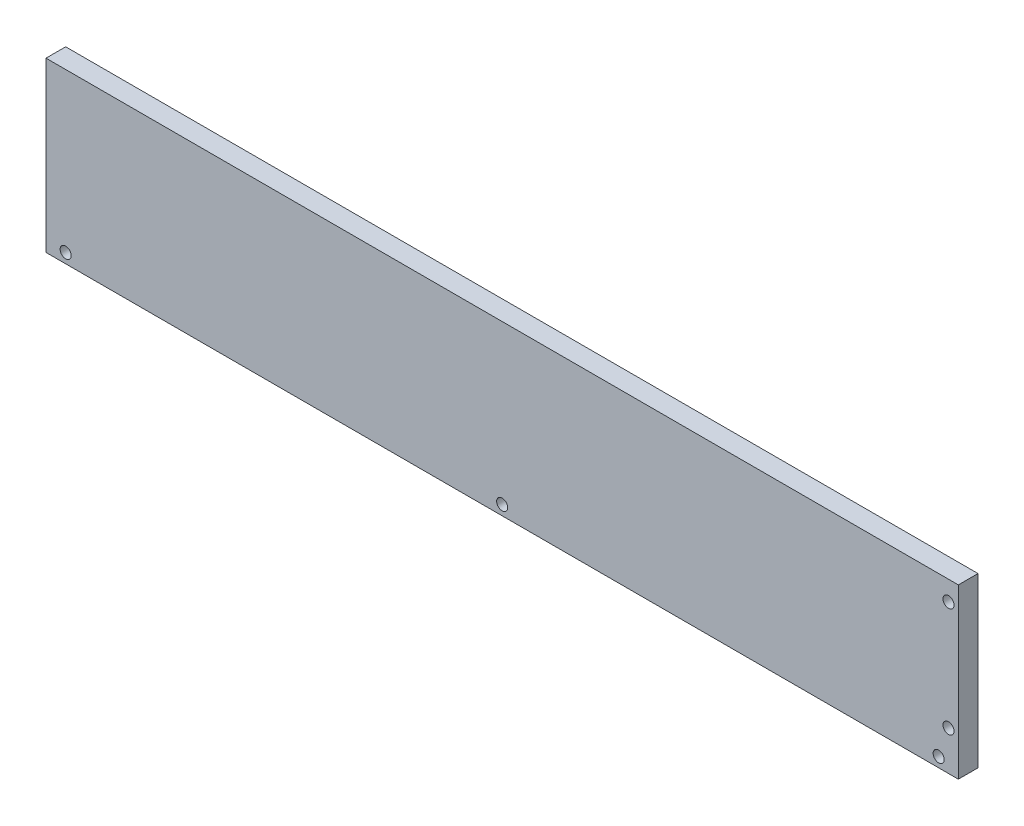
ISO-10303-21;
HEADER;
FILE_DESCRIPTION(('STEP AP214'),'2;1');
FILE_NAME('part.step','',(''),(''),'','','');
FILE_SCHEMA(('AUTOMOTIVE_DESIGN { 1 0 10303 214 1 1 1 1 }'));
ENDSEC;
DATA;
#1=APPLICATION_CONTEXT('core data for automotive mechanical design processes');
#2=APPLICATION_PROTOCOL_DEFINITION('international standard','automotive_design',2000,#1);
#3=PRODUCT_CONTEXT('',#1,'mechanical');
#4=PRODUCT('Part','Part','',(#3));
#5=PRODUCT_RELATED_PRODUCT_CATEGORY('part','',(#4));
#6=PRODUCT_DEFINITION_FORMATION('','',#4);
#7=PRODUCT_DEFINITION_CONTEXT('part definition',#1,'design');
#8=PRODUCT_DEFINITION('design','',#6,#7);
#9=PRODUCT_DEFINITION_SHAPE('','',#8);
#10=(LENGTH_UNIT() NAMED_UNIT(*) SI_UNIT(.MILLI.,.METRE.));
#11=(NAMED_UNIT(*) PLANE_ANGLE_UNIT() SI_UNIT($,.RADIAN.));
#12=(NAMED_UNIT(*) SI_UNIT($,.STERADIAN.) SOLID_ANGLE_UNIT());
#13=UNCERTAINTY_MEASURE_WITH_UNIT(LENGTH_MEASURE(1.E-05),#10,'distance_accuracy_value','');
#14=(GEOMETRIC_REPRESENTATION_CONTEXT(3) GLOBAL_UNCERTAINTY_ASSIGNED_CONTEXT((#13)) GLOBAL_UNIT_ASSIGNED_CONTEXT((#10,
#11,#12)) REPRESENTATION_CONTEXT('',''));
#15=CARTESIAN_POINT('',(0.,0.,0.));
#16=DIRECTION('',(0.,0.,1.));
#17=DIRECTION('',(1.,0.,0.));
#18=AXIS2_PLACEMENT_3D('',#15,#16,#17);
#19=CARTESIAN_POINT('',(0.,0.,6.35));
#20=DIRECTION('',(0.,0.,1.));
#21=DIRECTION('',(1.,0.,0.));
#22=AXIS2_PLACEMENT_3D('',#19,#20,#21);
#23=PLANE('',#22);
#24=CARTESIAN_POINT('',(-147.32,3.175,6.35));
#25=DIRECTION('',(0.,0.,1.));
#26=DIRECTION('',(1.,0.,0.));
#27=AXIS2_PLACEMENT_3D('',#24,#25,#26);
#28=CIRCLE('',#27,1.78593749999999);
#29=CARTESIAN_POINT('',(-145.5340625,3.175,6.35));
#30=VERTEX_POINT('',#29);
#31=EDGE_CURVE('E150',#30,#30,#28,.T.);
#32=ORIENTED_EDGE('',*,*,#31,.F.);
#33=EDGE_LOOP('',(#32));
#34=FACE_BOUND('',#33,.T.);
#35=CARTESIAN_POINT('',(-3.17499999999998,12.7,6.35));
#36=DIRECTION('',(0.,0.,1.));
#37=DIRECTION('',(1.,0.,0.));
#38=AXIS2_PLACEMENT_3D('',#35,#36,#37);
#39=CIRCLE('',#38,1.7859375);
#40=CARTESIAN_POINT('',(-1.38906249999998,12.7,6.35));
#41=VERTEX_POINT('',#40);
#42=EDGE_CURVE('E134',#41,#41,#39,.T.);
#43=ORIENTED_EDGE('',*,*,#42,.F.);
#44=EDGE_LOOP('',(#43));
#45=FACE_BOUND('',#44,.T.);
#46=DIRECTION('',(1.,0.,0.));
#47=VECTOR('',#46,1.);
#48=CARTESIAN_POINT('',(-294.64,0.,6.35));
#49=LINE('',#48,#47);
#50=CARTESIAN_POINT('',(-294.64,0.,6.35));
#51=VERTEX_POINT('',#50);
#52=CARTESIAN_POINT('',(0.,0.,6.35));
#53=VERTEX_POINT('',#52);
#54=EDGE_CURVE('E92',#51,#53,#49,.T.);
#55=ORIENTED_EDGE('',*,*,#54,.T.);
#56=DIRECTION('',(0.,1.,0.));
#57=VECTOR('',#56,1.);
#58=CARTESIAN_POINT('',(0.,0.,6.35));
#59=LINE('',#58,#57);
#60=CARTESIAN_POINT('',(0.,54.35,6.35));
#61=VERTEX_POINT('',#60);
#62=EDGE_CURVE('E87',#53,#61,#59,.T.);
#63=ORIENTED_EDGE('',*,*,#62,.T.);
#64=DIRECTION('',(-1.,0.,0.));
#65=VECTOR('',#64,1.);
#66=CARTESIAN_POINT('',(0.,54.35,6.35));
#67=LINE('',#66,#65);
#68=CARTESIAN_POINT('',(-294.64,54.35,6.35));
#69=VERTEX_POINT('',#68);
#70=EDGE_CURVE('E90',#61,#69,#67,.T.);
#71=ORIENTED_EDGE('',*,*,#70,.T.);
#72=DIRECTION('',(0.,-1.,0.));
#73=VECTOR('',#72,1.);
#74=CARTESIAN_POINT('',(-294.64,54.35,6.35));
#75=LINE('',#74,#73);
#76=EDGE_CURVE('E57',#69,#51,#75,.T.);
#77=ORIENTED_EDGE('',*,*,#76,.T.);
#78=EDGE_LOOP('',(#55,#63,#71,#77));
#79=FACE_BOUND('',#78,.T.);
#80=CARTESIAN_POINT('',(-3.175,48.,6.35));
#81=DIRECTION('',(0.,0.,1.));
#82=DIRECTION('',(1.,0.,0.));
#83=AXIS2_PLACEMENT_3D('',#80,#81,#82);
#84=CIRCLE('',#83,1.7859375);
#85=CARTESIAN_POINT('',(-1.3890625,48.,6.35));
#86=VERTEX_POINT('',#85);
#87=EDGE_CURVE('E112',#86,#86,#84,.T.);
#88=ORIENTED_EDGE('',*,*,#87,.F.);
#89=EDGE_LOOP('',(#88));
#90=FACE_BOUND('',#89,.T.);
#91=CARTESIAN_POINT('',(-6.35,3.175,6.35));
#92=DIRECTION('',(0.,0.,1.));
#93=DIRECTION('',(1.,0.,0.));
#94=AXIS2_PLACEMENT_3D('',#91,#92,#93);
#95=CIRCLE('',#94,1.7859375);
#96=CARTESIAN_POINT('',(-4.5640625,3.175,6.35));
#97=VERTEX_POINT('',#96);
#98=EDGE_CURVE('E142',#97,#97,#95,.T.);
#99=ORIENTED_EDGE('',*,*,#98,.F.);
#100=EDGE_LOOP('',(#99));
#101=FACE_BOUND('',#100,.T.);
#102=CARTESIAN_POINT('',(-288.29,3.175,6.35));
#103=DIRECTION('',(0.,0.,1.));
#104=DIRECTION('',(1.,0.,0.));
#105=AXIS2_PLACEMENT_3D('',#102,#103,#104);
#106=CIRCLE('',#105,1.78593749999999);
#107=CARTESIAN_POINT('',(-286.5040625,3.175,6.35));
#108=VERTEX_POINT('',#107);
#109=EDGE_CURVE('E158',#108,#108,#106,.T.);
#110=ORIENTED_EDGE('',*,*,#109,.F.);
#111=EDGE_LOOP('',(#110));
#112=FACE_BOUND('',#111,.T.);
#113=ADVANCED_FACE('F39',(#34,#45,#79,#90,#101,#112),#23,.T.);
#114=CARTESIAN_POINT('',(0.,0.,0.));
#115=DIRECTION('',(0.,0.,1.));
#116=DIRECTION('',(1.,0.,0.));
#117=AXIS2_PLACEMENT_3D('',#114,#115,#116);
#118=PLANE('',#117);
#119=DIRECTION('',(1.,0.,0.));
#120=VECTOR('',#119,1.);
#121=CARTESIAN_POINT('',(-294.64,0.,0.));
#122=LINE('',#121,#120);
#123=CARTESIAN_POINT('',(-294.64,0.,0.));
#124=VERTEX_POINT('',#123);
#125=CARTESIAN_POINT('',(0.,0.,0.));
#126=VERTEX_POINT('',#125);
#127=EDGE_CURVE('E108',#124,#126,#122,.T.);
#128=ORIENTED_EDGE('',*,*,#127,.F.);
#129=DIRECTION('',(0.,-1.,0.));
#130=VECTOR('',#129,1.);
#131=CARTESIAN_POINT('',(-294.64,54.35,0.));
#132=LINE('',#131,#130);
#133=CARTESIAN_POINT('',(-294.64,54.35,0.));
#134=VERTEX_POINT('',#133);
#135=EDGE_CURVE('E80',#134,#124,#132,.T.);
#136=ORIENTED_EDGE('',*,*,#135,.F.);
#137=DIRECTION('',(-1.,0.,0.));
#138=VECTOR('',#137,1.);
#139=CARTESIAN_POINT('',(0.,54.35,0.));
#140=LINE('',#139,#138);
#141=CARTESIAN_POINT('',(0.,54.35,0.));
#142=VERTEX_POINT('',#141);
#143=EDGE_CURVE('E74',#142,#134,#140,.T.);
#144=ORIENTED_EDGE('',*,*,#143,.F.);
#145=DIRECTION('',(0.,1.,0.));
#146=VECTOR('',#145,1.);
#147=CARTESIAN_POINT('',(0.,0.,0.));
#148=LINE('',#147,#146);
#149=EDGE_CURVE('E97',#126,#142,#148,.T.);
#150=ORIENTED_EDGE('',*,*,#149,.F.);
#151=EDGE_LOOP('',(#128,#136,#144,#150));
#152=FACE_BOUND('',#151,.T.);
#153=CARTESIAN_POINT('',(-3.175,48.,0.));
#154=DIRECTION('',(0.,0.,1.));
#155=DIRECTION('',(1.,0.,0.));
#156=AXIS2_PLACEMENT_3D('',#153,#154,#155);
#157=CIRCLE('',#156,1.7859375);
#158=CARTESIAN_POINT('',(-1.3890625,48.,0.));
#159=VERTEX_POINT('',#158);
#160=EDGE_CURVE('E130',#159,#159,#157,.T.);
#161=ORIENTED_EDGE('',*,*,#160,.T.);
#162=EDGE_LOOP('',(#161));
#163=FACE_BOUND('',#162,.T.);
#164=CARTESIAN_POINT('',(-3.17499999999998,12.7,0.));
#165=DIRECTION('',(0.,0.,1.));
#166=DIRECTION('',(1.,0.,0.));
#167=AXIS2_PLACEMENT_3D('',#164,#165,#166);
#168=CIRCLE('',#167,1.7859375);
#169=CARTESIAN_POINT('',(-1.38906249999998,12.7,0.));
#170=VERTEX_POINT('',#169);
#171=EDGE_CURVE('E138',#170,#170,#168,.T.);
#172=ORIENTED_EDGE('',*,*,#171,.T.);
#173=EDGE_LOOP('',(#172));
#174=FACE_BOUND('',#173,.T.);
#175=CARTESIAN_POINT('',(-6.35,3.175,0.));
#176=DIRECTION('',(0.,0.,1.));
#177=DIRECTION('',(1.,0.,0.));
#178=AXIS2_PLACEMENT_3D('',#175,#176,#177);
#179=CIRCLE('',#178,1.7859375);
#180=CARTESIAN_POINT('',(-4.5640625,3.175,0.));
#181=VERTEX_POINT('',#180);
#182=EDGE_CURVE('E146',#181,#181,#179,.T.);
#183=ORIENTED_EDGE('',*,*,#182,.T.);
#184=EDGE_LOOP('',(#183));
#185=FACE_BOUND('',#184,.T.);
#186=CARTESIAN_POINT('',(-147.32,3.175,0.));
#187=DIRECTION('',(0.,0.,1.));
#188=DIRECTION('',(1.,0.,0.));
#189=AXIS2_PLACEMENT_3D('',#186,#187,#188);
#190=CIRCLE('',#189,1.78593749999999);
#191=CARTESIAN_POINT('',(-145.5340625,3.175,0.));
#192=VERTEX_POINT('',#191);
#193=EDGE_CURVE('E154',#192,#192,#190,.T.);
#194=ORIENTED_EDGE('',*,*,#193,.T.);
#195=EDGE_LOOP('',(#194));
#196=FACE_BOUND('',#195,.T.);
#197=CARTESIAN_POINT('',(-288.29,3.175,0.));
#198=DIRECTION('',(0.,0.,1.));
#199=DIRECTION('',(1.,0.,0.));
#200=AXIS2_PLACEMENT_3D('',#197,#198,#199);
#201=CIRCLE('',#200,1.78593749999999);
#202=CARTESIAN_POINT('',(-286.5040625,3.175,0.));
#203=VERTEX_POINT('',#202);
#204=EDGE_CURVE('E162',#203,#203,#201,.T.);
#205=ORIENTED_EDGE('',*,*,#204,.T.);
#206=EDGE_LOOP('',(#205));
#207=FACE_BOUND('',#206,.T.);
#208=ADVANCED_FACE('F125',(#152,#163,#174,#185,#196,#207),#118,.F.);
#209=CARTESIAN_POINT('',(-294.64,0.,6.35));
#210=DIRECTION('',(0.,1.,0.));
#211=DIRECTION('',(0.,0.,1.));
#212=AXIS2_PLACEMENT_3D('',#209,#210,#211);
#213=PLANE('',#212);
#214=ORIENTED_EDGE('',*,*,#127,.T.);
#215=DIRECTION('',(0.,0.,-1.));
#216=VECTOR('',#215,1.);
#217=CARTESIAN_POINT('',(0.,0.,6.35));
#218=LINE('',#217,#216);
#219=EDGE_CURVE('E11',#53,#126,#218,.T.);
#220=ORIENTED_EDGE('',*,*,#219,.F.);
#221=ORIENTED_EDGE('',*,*,#54,.F.);
#222=DIRECTION('',(0.,0.,-1.));
#223=VECTOR('',#222,1.);
#224=CARTESIAN_POINT('',(-294.64,0.,6.35));
#225=LINE('',#224,#223);
#226=EDGE_CURVE('E104',#51,#124,#225,.T.);
#227=ORIENTED_EDGE('',*,*,#226,.T.);
#228=EDGE_LOOP('',(#214,#220,#221,#227));
#229=FACE_BOUND('',#228,.T.);
#230=ADVANCED_FACE('F41',(#229),#213,.F.);
#231=CARTESIAN_POINT('',(0.,0.,6.35));
#232=DIRECTION('',(-1.,0.,0.));
#233=DIRECTION('',(0.,0.,1.));
#234=AXIS2_PLACEMENT_3D('',#231,#232,#233);
#235=PLANE('',#234);
#236=ORIENTED_EDGE('',*,*,#149,.T.);
#237=DIRECTION('',(0.,0.,-1.));
#238=VECTOR('',#237,1.);
#239=CARTESIAN_POINT('',(0.,54.35,6.35));
#240=LINE('',#239,#238);
#241=EDGE_CURVE('E49',#61,#142,#240,.T.);
#242=ORIENTED_EDGE('',*,*,#241,.F.);
#243=ORIENTED_EDGE('',*,*,#62,.F.);
#244=ORIENTED_EDGE('',*,*,#219,.T.);
#245=EDGE_LOOP('',(#236,#242,#243,#244));
#246=FACE_BOUND('',#245,.T.);
#247=ADVANCED_FACE('F96',(#246),#235,.F.);
#248=CARTESIAN_POINT('',(0.,54.35,6.35));
#249=DIRECTION('',(0.,-1.,0.));
#250=DIRECTION('',(0.,0.,-1.));
#251=AXIS2_PLACEMENT_3D('',#248,#249,#250);
#252=PLANE('',#251);
#253=ORIENTED_EDGE('',*,*,#143,.T.);
#254=DIRECTION('',(0.,0.,-1.));
#255=VECTOR('',#254,1.);
#256=CARTESIAN_POINT('',(-294.64,54.35,6.35));
#257=LINE('',#256,#255);
#258=EDGE_CURVE('E99',#69,#134,#257,.T.);
#259=ORIENTED_EDGE('',*,*,#258,.F.);
#260=ORIENTED_EDGE('',*,*,#70,.F.);
#261=ORIENTED_EDGE('',*,*,#241,.T.);
#262=EDGE_LOOP('',(#253,#259,#260,#261));
#263=FACE_BOUND('',#262,.T.);
#264=ADVANCED_FACE('F100',(#263),#252,.F.);
#265=CARTESIAN_POINT('',(-294.64,54.35,6.35));
#266=DIRECTION('',(1.,0.,0.));
#267=DIRECTION('',(0.,0.,-1.));
#268=AXIS2_PLACEMENT_3D('',#265,#266,#267);
#269=PLANE('',#268);
#270=ORIENTED_EDGE('',*,*,#135,.T.);
#271=ORIENTED_EDGE('',*,*,#226,.F.);
#272=ORIENTED_EDGE('',*,*,#76,.F.);
#273=ORIENTED_EDGE('',*,*,#258,.T.);
#274=EDGE_LOOP('',(#270,#271,#272,#273));
#275=FACE_BOUND('',#274,.T.);
#276=ADVANCED_FACE('F122',(#275),#269,.F.);
#277=CARTESIAN_POINT('',(-3.175,48.,6.35));
#278=DIRECTION('',(0.,0.,-1.));
#279=DIRECTION('',(-1.,0.,0.));
#280=AXIS2_PLACEMENT_3D('',#277,#278,#279);
#281=CYLINDRICAL_SURFACE('',#280,1.7859375);
#282=ORIENTED_EDGE('',*,*,#87,.T.);
#283=EDGE_LOOP('',(#282));
#284=FACE_BOUND('',#283,.T.);
#285=ORIENTED_EDGE('',*,*,#160,.F.);
#286=EDGE_LOOP('',(#285));
#287=FACE_BOUND('',#286,.T.);
#288=ADVANCED_FACE('F183',(#284,#287),#281,.F.);
#289=CARTESIAN_POINT('',(-3.17499999999998,12.7,6.35));
#290=DIRECTION('',(0.,0.,-1.));
#291=DIRECTION('',(-1.,0.,0.));
#292=AXIS2_PLACEMENT_3D('',#289,#290,#291);
#293=CYLINDRICAL_SURFACE('',#292,1.7859375);
#294=ORIENTED_EDGE('',*,*,#42,.T.);
#295=EDGE_LOOP('',(#294));
#296=FACE_BOUND('',#295,.T.);
#297=ORIENTED_EDGE('',*,*,#171,.F.);
#298=EDGE_LOOP('',(#297));
#299=FACE_BOUND('',#298,.T.);
#300=ADVANCED_FACE('F229',(#296,#299),#293,.F.);
#301=CARTESIAN_POINT('',(-6.35,3.175,6.35));
#302=DIRECTION('',(0.,0.,-1.));
#303=DIRECTION('',(-1.,0.,0.));
#304=AXIS2_PLACEMENT_3D('',#301,#302,#303);
#305=CYLINDRICAL_SURFACE('',#304,1.7859375);
#306=ORIENTED_EDGE('',*,*,#98,.T.);
#307=EDGE_LOOP('',(#306));
#308=FACE_BOUND('',#307,.T.);
#309=ORIENTED_EDGE('',*,*,#182,.F.);
#310=EDGE_LOOP('',(#309));
#311=FACE_BOUND('',#310,.T.);
#312=ADVANCED_FACE('F237',(#308,#311),#305,.F.);
#313=CARTESIAN_POINT('',(-147.32,3.175,6.35));
#314=DIRECTION('',(0.,0.,-1.));
#315=DIRECTION('',(-1.,0.,0.));
#316=AXIS2_PLACEMENT_3D('',#313,#314,#315);
#317=CYLINDRICAL_SURFACE('',#316,1.78593749999999);
#318=ORIENTED_EDGE('',*,*,#31,.T.);
#319=EDGE_LOOP('',(#318));
#320=FACE_BOUND('',#319,.T.);
#321=ORIENTED_EDGE('',*,*,#193,.F.);
#322=EDGE_LOOP('',(#321));
#323=FACE_BOUND('',#322,.T.);
#324=ADVANCED_FACE('F245',(#320,#323),#317,.F.);
#325=CARTESIAN_POINT('',(-288.29,3.175,6.35));
#326=DIRECTION('',(0.,0.,-1.));
#327=DIRECTION('',(-1.,0.,0.));
#328=AXIS2_PLACEMENT_3D('',#325,#326,#327);
#329=CYLINDRICAL_SURFACE('',#328,1.78593749999999);
#330=ORIENTED_EDGE('',*,*,#109,.T.);
#331=EDGE_LOOP('',(#330));
#332=FACE_BOUND('',#331,.T.);
#333=ORIENTED_EDGE('',*,*,#204,.F.);
#334=EDGE_LOOP('',(#333));
#335=FACE_BOUND('',#334,.T.);
#336=ADVANCED_FACE('F170',(#332,#335),#329,.F.);
#337=CLOSED_SHELL('',(#113,#208,#230,#247,#264,#276,#288,#300,#312,#324,#336));
#338=MANIFOLD_SOLID_BREP('B2',#337);
#339=ADVANCED_BREP_SHAPE_REPRESENTATION('',(#18,#338),#14);
#340=SHAPE_DEFINITION_REPRESENTATION(#9,#339);
ENDSEC;
END-ISO-10303-21;
